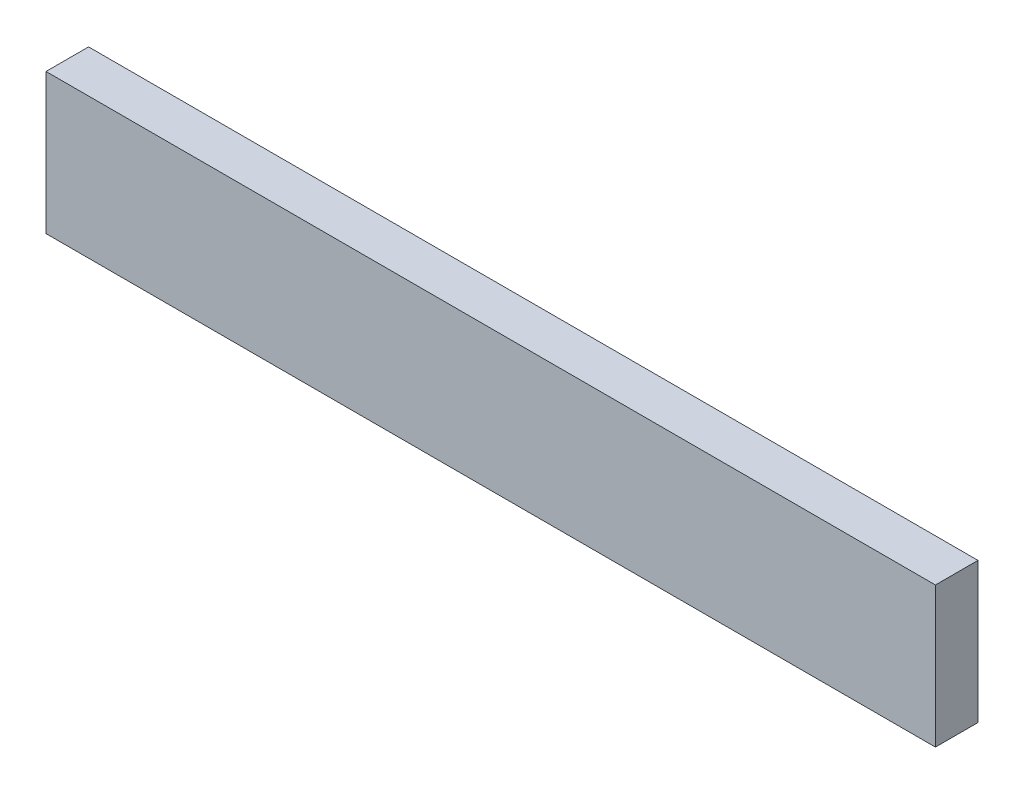
ISO-10303-21;
HEADER;
FILE_DESCRIPTION(('STEP AP214'),'2;1');
FILE_NAME('part.step','',(''),(''),'','','');
FILE_SCHEMA(('AUTOMOTIVE_DESIGN { 1 0 10303 214 1 1 1 1 }'));
ENDSEC;
DATA;
#1=APPLICATION_CONTEXT('core data for automotive mechanical design processes');
#2=APPLICATION_PROTOCOL_DEFINITION('international standard','automotive_design',2000,#1);
#3=PRODUCT_CONTEXT('',#1,'mechanical');
#4=PRODUCT('Part','Part','',(#3));
#5=PRODUCT_RELATED_PRODUCT_CATEGORY('part','',(#4));
#6=PRODUCT_DEFINITION_FORMATION('','',#4);
#7=PRODUCT_DEFINITION_CONTEXT('part definition',#1,'design');
#8=PRODUCT_DEFINITION('design','',#6,#7);
#9=PRODUCT_DEFINITION_SHAPE('','',#8);
#10=(LENGTH_UNIT() NAMED_UNIT(*) SI_UNIT(.MILLI.,.METRE.));
#11=(NAMED_UNIT(*) PLANE_ANGLE_UNIT() SI_UNIT($,.RADIAN.));
#12=(NAMED_UNIT(*) SI_UNIT($,.STERADIAN.) SOLID_ANGLE_UNIT());
#13=UNCERTAINTY_MEASURE_WITH_UNIT(LENGTH_MEASURE(1.E-05),#10,'distance_accuracy_value','');
#14=(GEOMETRIC_REPRESENTATION_CONTEXT(3) GLOBAL_UNCERTAINTY_ASSIGNED_CONTEXT((#13)) GLOBAL_UNIT_ASSIGNED_CONTEXT((#10,
#11,#12)) REPRESENTATION_CONTEXT('',''));
#15=CARTESIAN_POINT('',(0.,0.,0.));
#16=DIRECTION('',(0.,0.,1.));
#17=DIRECTION('',(1.,0.,0.));
#18=AXIS2_PLACEMENT_3D('',#15,#16,#17);
#19=CARTESIAN_POINT('',(0.,0.,0.));
#20=DIRECTION('',(0.,0.,1.));
#21=DIRECTION('',(0.,-1.,0.));
#22=AXIS2_PLACEMENT_3D('',#19,#20,#21);
#23=PLANE('',#22);
#24=DIRECTION('',(0.,1.,0.));
#25=VECTOR('',#24,1.);
#26=CARTESIAN_POINT('',(-9.652,1.524,0.));
#27=LINE('',#26,#25);
#28=CARTESIAN_POINT('',(-9.652,1.524,0.));
#29=VERTEX_POINT('',#28);
#30=CARTESIAN_POINT('',(-9.652,-1.524,0.));
#31=VERTEX_POINT('',#30);
#32=EDGE_CURVE('E78',#29,#31,#27,.F.);
#33=ORIENTED_EDGE('',*,*,#32,.F.);
#34=DIRECTION('',(1.,0.,0.));
#35=VECTOR('',#34,1.);
#36=CARTESIAN_POINT('',(9.652,1.524,0.));
#37=LINE('',#36,#35);
#38=CARTESIAN_POINT('',(9.652,1.524,0.));
#39=VERTEX_POINT('',#38);
#40=EDGE_CURVE('E54',#39,#29,#37,.F.);
#41=ORIENTED_EDGE('',*,*,#40,.F.);
#42=DIRECTION('',(0.,1.,0.));
#43=VECTOR('',#42,1.);
#44=CARTESIAN_POINT('',(9.652,-1.524,0.));
#45=LINE('',#44,#43);
#46=CARTESIAN_POINT('',(9.652,-1.524,0.));
#47=VERTEX_POINT('',#46);
#48=EDGE_CURVE('E56',#47,#39,#45,.T.);
#49=ORIENTED_EDGE('',*,*,#48,.F.);
#50=DIRECTION('',(1.,0.,0.));
#51=VECTOR('',#50,1.);
#52=CARTESIAN_POINT('',(-9.652,-1.524,0.));
#53=LINE('',#52,#51);
#54=EDGE_CURVE('E19',#31,#47,#53,.T.);
#55=ORIENTED_EDGE('',*,*,#54,.F.);
#56=EDGE_LOOP('',(#33,#41,#49,#55));
#57=FACE_BOUND('',#56,.T.);
#58=ADVANCED_FACE('F16',(#57),#23,.F.);
#59=CARTESIAN_POINT('',(-9.652,-1.524,0.));
#60=DIRECTION('',(0.,-1.,0.));
#61=DIRECTION('',(0.,0.,-1.));
#62=AXIS2_PLACEMENT_3D('',#59,#60,#61);
#63=PLANE('',#62);
#64=DIRECTION('',(1.,0.,0.));
#65=VECTOR('',#64,1.);
#66=CARTESIAN_POINT('',(0.,-1.524,0.924000000000002));
#67=LINE('',#66,#65);
#68=CARTESIAN_POINT('',(-9.652,-1.524,0.924000000000002));
#69=VERTEX_POINT('',#68);
#70=CARTESIAN_POINT('',(9.652,-1.524,0.924000000000003));
#71=VERTEX_POINT('',#70);
#72=EDGE_CURVE('E82',#69,#71,#67,.T.);
#73=ORIENTED_EDGE('',*,*,#72,.F.);
#74=DIRECTION('',(0.,0.,1.));
#75=VECTOR('',#74,1.);
#76=CARTESIAN_POINT('',(-9.652,-1.524,0.));
#77=LINE('',#76,#75);
#78=EDGE_CURVE('E67',#31,#69,#77,.T.);
#79=ORIENTED_EDGE('',*,*,#78,.F.);
#80=ORIENTED_EDGE('',*,*,#54,.T.);
#81=DIRECTION('',(0.,0.,-1.));
#82=VECTOR('',#81,1.);
#83=CARTESIAN_POINT('',(9.652,-1.524,0.));
#84=LINE('',#83,#82);
#85=EDGE_CURVE('E62',#71,#47,#84,.T.);
#86=ORIENTED_EDGE('',*,*,#85,.F.);
#87=EDGE_LOOP('',(#73,#79,#80,#86));
#88=FACE_BOUND('',#87,.T.);
#89=ADVANCED_FACE('F64',(#88),#63,.T.);
#90=CARTESIAN_POINT('',(9.652,-1.524,0.));
#91=DIRECTION('',(1.,0.,0.));
#92=DIRECTION('',(0.,0.,-1.));
#93=AXIS2_PLACEMENT_3D('',#90,#91,#92);
#94=PLANE('',#93);
#95=DIRECTION('',(0.,-1.,0.));
#96=VECTOR('',#95,1.);
#97=CARTESIAN_POINT('',(9.652,0.,0.924000000000002));
#98=LINE('',#97,#96);
#99=CARTESIAN_POINT('',(9.652,1.524,0.924000000000001));
#100=VERTEX_POINT('',#99);
#101=EDGE_CURVE('E71',#71,#100,#98,.F.);
#102=ORIENTED_EDGE('',*,*,#101,.F.);
#103=ORIENTED_EDGE('',*,*,#85,.T.);
#104=ORIENTED_EDGE('',*,*,#48,.T.);
#105=DIRECTION('',(0.,0.,1.));
#106=VECTOR('',#105,1.);
#107=CARTESIAN_POINT('',(9.652,1.524,0.));
#108=LINE('',#107,#106);
#109=EDGE_CURVE('E74',#100,#39,#108,.F.);
#110=ORIENTED_EDGE('',*,*,#109,.F.);
#111=EDGE_LOOP('',(#102,#103,#104,#110));
#112=FACE_BOUND('',#111,.T.);
#113=ADVANCED_FACE('F69',(#112),#94,.T.);
#114=CARTESIAN_POINT('',(9.652,1.524,0.));
#115=DIRECTION('',(0.,1.,0.));
#116=DIRECTION('',(0.,0.,1.));
#117=AXIS2_PLACEMENT_3D('',#114,#115,#116);
#118=PLANE('',#117);
#119=DIRECTION('',(1.,0.,0.));
#120=VECTOR('',#119,1.);
#121=CARTESIAN_POINT('',(0.,1.524,0.924000000000002));
#122=LINE('',#121,#120);
#123=CARTESIAN_POINT('',(-9.652,1.524,0.923999999999998));
#124=VERTEX_POINT('',#123);
#125=EDGE_CURVE('E25',#100,#124,#122,.F.);
#126=ORIENTED_EDGE('',*,*,#125,.F.);
#127=ORIENTED_EDGE('',*,*,#109,.T.);
#128=ORIENTED_EDGE('',*,*,#40,.T.);
#129=DIRECTION('',(0.,0.,1.));
#130=VECTOR('',#129,1.);
#131=CARTESIAN_POINT('',(-9.652,1.524,0.));
#132=LINE('',#131,#130);
#133=EDGE_CURVE('E34',#124,#29,#132,.F.);
#134=ORIENTED_EDGE('',*,*,#133,.F.);
#135=EDGE_LOOP('',(#126,#127,#128,#134));
#136=FACE_BOUND('',#135,.T.);
#137=ADVANCED_FACE('F88',(#136),#118,.T.);
#138=CARTESIAN_POINT('',(-9.652,1.524,0.));
#139=DIRECTION('',(-1.,0.,0.));
#140=DIRECTION('',(0.,0.,1.));
#141=AXIS2_PLACEMENT_3D('',#138,#139,#140);
#142=PLANE('',#141);
#143=DIRECTION('',(0.,-1.,0.));
#144=VECTOR('',#143,1.);
#145=CARTESIAN_POINT('',(-9.652,0.,0.924000000000002));
#146=LINE('',#145,#144);
#147=EDGE_CURVE('E11',#124,#69,#146,.T.);
#148=ORIENTED_EDGE('',*,*,#147,.F.);
#149=ORIENTED_EDGE('',*,*,#133,.T.);
#150=ORIENTED_EDGE('',*,*,#32,.T.);
#151=ORIENTED_EDGE('',*,*,#78,.T.);
#152=EDGE_LOOP('',(#148,#149,#150,#151));
#153=FACE_BOUND('',#152,.T.);
#154=ADVANCED_FACE('F90',(#153),#142,.T.);
#155=CARTESIAN_POINT('',(0.,0.,0.924000000000002));
#156=DIRECTION('',(0.,0.,1.));
#157=DIRECTION('',(0.,-1.,0.));
#158=AXIS2_PLACEMENT_3D('',#155,#156,#157);
#159=PLANE('',#158);
#160=ORIENTED_EDGE('',*,*,#125,.T.);
#161=ORIENTED_EDGE('',*,*,#147,.T.);
#162=ORIENTED_EDGE('',*,*,#72,.T.);
#163=ORIENTED_EDGE('',*,*,#101,.T.);
#164=EDGE_LOOP('',(#160,#161,#162,#163));
#165=FACE_BOUND('',#164,.T.);
#166=ADVANCED_FACE('F87',(#165),#159,.T.);
#167=CLOSED_SHELL('',(#58,#89,#113,#137,#154,#166));
#168=MANIFOLD_SOLID_BREP('B1',#167);
#169=ADVANCED_BREP_SHAPE_REPRESENTATION('',(#18,#168),#14);
#170=SHAPE_DEFINITION_REPRESENTATION(#9,#169);
ENDSEC;
END-ISO-10303-21;
